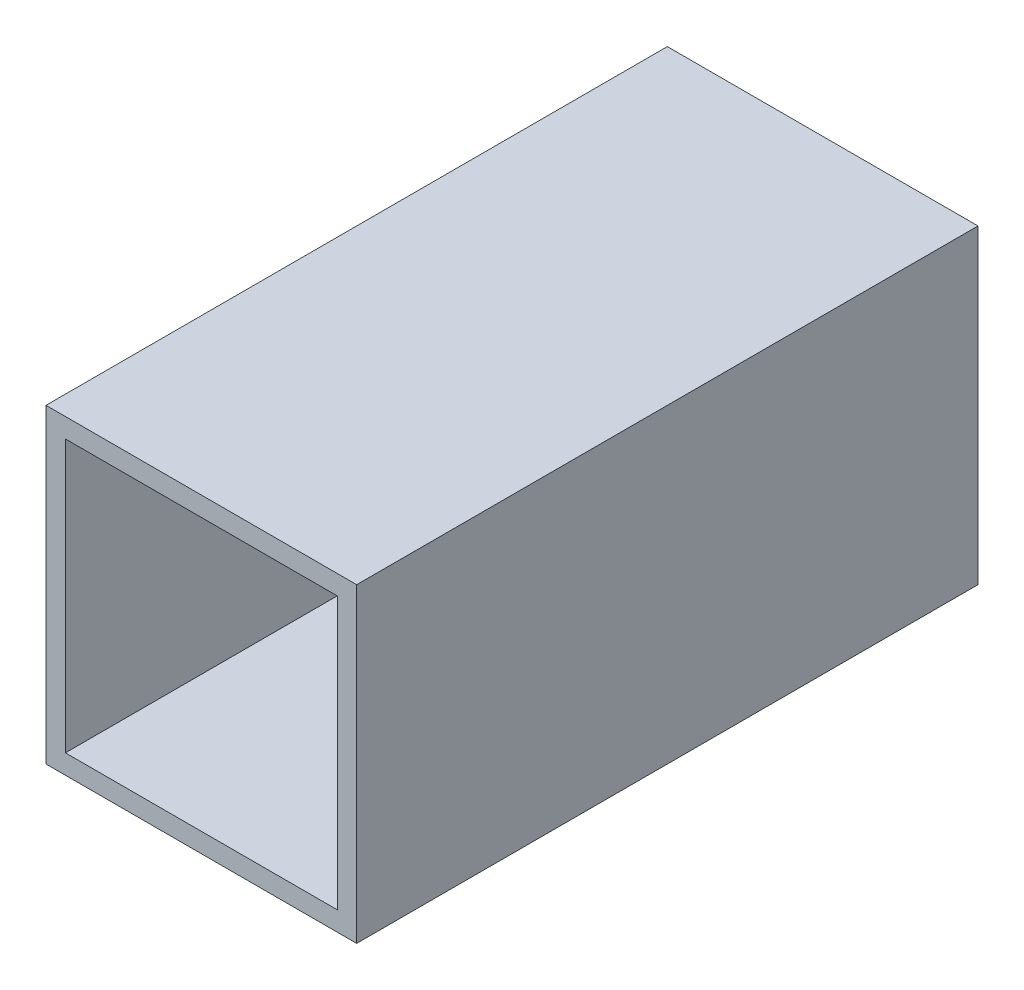
ISO-10303-21;
HEADER;
FILE_DESCRIPTION(('STEP AP214'),'2;1');
FILE_NAME('part.step','',(''),(''),'','','');
FILE_SCHEMA(('AUTOMOTIVE_DESIGN { 1 0 10303 214 1 1 1 1 }'));
ENDSEC;
DATA;
#1=APPLICATION_CONTEXT('core data for automotive mechanical design processes');
#2=APPLICATION_PROTOCOL_DEFINITION('international standard','automotive_design',2000,#1);
#3=PRODUCT_CONTEXT('',#1,'mechanical');
#4=PRODUCT('Part','Part','',(#3));
#5=PRODUCT_RELATED_PRODUCT_CATEGORY('part','',(#4));
#6=PRODUCT_DEFINITION_FORMATION('','',#4);
#7=PRODUCT_DEFINITION_CONTEXT('part definition',#1,'design');
#8=PRODUCT_DEFINITION('design','',#6,#7);
#9=PRODUCT_DEFINITION_SHAPE('','',#8);
#10=(LENGTH_UNIT() NAMED_UNIT(*) SI_UNIT(.MILLI.,.METRE.));
#11=(NAMED_UNIT(*) PLANE_ANGLE_UNIT() SI_UNIT($,.RADIAN.));
#12=(NAMED_UNIT(*) SI_UNIT($,.STERADIAN.) SOLID_ANGLE_UNIT());
#13=UNCERTAINTY_MEASURE_WITH_UNIT(LENGTH_MEASURE(1.E-05),#10,'distance_accuracy_value','');
#14=(GEOMETRIC_REPRESENTATION_CONTEXT(3) GLOBAL_UNCERTAINTY_ASSIGNED_CONTEXT((#13)) GLOBAL_UNIT_ASSIGNED_CONTEXT((#10,
#11,#12)) REPRESENTATION_CONTEXT('',''));
#15=CARTESIAN_POINT('',(0.,0.,0.));
#16=DIRECTION('',(0.,0.,1.));
#17=DIRECTION('',(1.,0.,0.));
#18=AXIS2_PLACEMENT_3D('',#15,#16,#17);
#19=CARTESIAN_POINT('',(0.,0.,50.8));
#20=DIRECTION('',(0.,0.,-1.));
#21=DIRECTION('',(-1.,0.,0.));
#22=AXIS2_PLACEMENT_3D('',#19,#20,#21);
#23=PLANE('',#22);
#24=DIRECTION('',(0.,1.,0.));
#25=VECTOR('',#24,1.);
#26=CARTESIAN_POINT('',(12.7,-12.7,50.8));
#27=LINE('',#26,#25);
#28=CARTESIAN_POINT('',(12.7,-12.7,50.8));
#29=VERTEX_POINT('',#28);
#30=CARTESIAN_POINT('',(12.7,12.7,50.8));
#31=VERTEX_POINT('',#30);
#32=EDGE_CURVE('E133',#29,#31,#27,.T.);
#33=ORIENTED_EDGE('',*,*,#32,.T.);
#34=DIRECTION('',(-1.,0.,0.));
#35=VECTOR('',#34,1.);
#36=CARTESIAN_POINT('',(-12.7,12.7,50.8));
#37=LINE('',#36,#35);
#38=CARTESIAN_POINT('',(-12.7,12.7,50.8));
#39=VERTEX_POINT('',#38);
#40=EDGE_CURVE('E136',#31,#39,#37,.T.);
#41=ORIENTED_EDGE('',*,*,#40,.T.);
#42=DIRECTION('',(0.,-1.,0.));
#43=VECTOR('',#42,1.);
#44=CARTESIAN_POINT('',(-12.7,-12.7,50.8));
#45=LINE('',#44,#43);
#46=CARTESIAN_POINT('',(-12.7,-12.7,50.8));
#47=VERTEX_POINT('',#46);
#48=EDGE_CURVE('E139',#39,#47,#45,.T.);
#49=ORIENTED_EDGE('',*,*,#48,.T.);
#50=DIRECTION('',(1.,0.,0.));
#51=VECTOR('',#50,1.);
#52=CARTESIAN_POINT('',(-12.7,-12.7,50.8));
#53=LINE('',#52,#51);
#54=EDGE_CURVE('E141',#47,#29,#53,.T.);
#55=ORIENTED_EDGE('',*,*,#54,.T.);
#56=EDGE_LOOP('',(#33,#41,#49,#55));
#57=FACE_BOUND('',#56,.T.);
#58=DIRECTION('',(0.,1.,0.));
#59=VECTOR('',#58,1.);
#60=CARTESIAN_POINT('',(11.1125,-11.1125,50.8));
#61=LINE('',#60,#59);
#62=CARTESIAN_POINT('',(11.1125,-11.1125,50.8));
#63=VERTEX_POINT('',#62);
#64=CARTESIAN_POINT('',(11.1125,11.1125,50.8));
#65=VERTEX_POINT('',#64);
#66=EDGE_CURVE('E97',#63,#65,#61,.T.);
#67=ORIENTED_EDGE('',*,*,#66,.F.);
#68=DIRECTION('',(1.,0.,0.));
#69=VECTOR('',#68,1.);
#70=CARTESIAN_POINT('',(-11.1125,-11.1125,50.8));
#71=LINE('',#70,#69);
#72=CARTESIAN_POINT('',(-11.1125,-11.1125,50.8));
#73=VERTEX_POINT('',#72);
#74=EDGE_CURVE('E119',#73,#63,#71,.T.);
#75=ORIENTED_EDGE('',*,*,#74,.F.);
#76=DIRECTION('',(0.,-1.,0.));
#77=VECTOR('',#76,1.);
#78=CARTESIAN_POINT('',(-11.1125,-11.1125,50.8));
#79=LINE('',#78,#77);
#80=CARTESIAN_POINT('',(-11.1125,11.1125,50.8));
#81=VERTEX_POINT('',#80);
#82=EDGE_CURVE('E117',#81,#73,#79,.T.);
#83=ORIENTED_EDGE('',*,*,#82,.F.);
#84=DIRECTION('',(-1.,0.,0.));
#85=VECTOR('',#84,1.);
#86=CARTESIAN_POINT('',(-11.1125,11.1125,50.8));
#87=LINE('',#86,#85);
#88=EDGE_CURVE('E105',#65,#81,#87,.T.);
#89=ORIENTED_EDGE('',*,*,#88,.F.);
#90=EDGE_LOOP('',(#67,#75,#83,#89));
#91=FACE_BOUND('',#90,.T.);
#92=ADVANCED_FACE('F32',(#57,#91),#23,.F.);
#93=CARTESIAN_POINT('',(0.,0.,0.));
#94=DIRECTION('',(0.,0.,-1.));
#95=DIRECTION('',(-1.,0.,0.));
#96=AXIS2_PLACEMENT_3D('',#93,#94,#95);
#97=PLANE('',#96);
#98=DIRECTION('',(0.,1.,0.));
#99=VECTOR('',#98,1.);
#100=CARTESIAN_POINT('',(12.7,-12.7,0.));
#101=LINE('',#100,#99);
#102=CARTESIAN_POINT('',(12.7,-12.7,0.));
#103=VERTEX_POINT('',#102);
#104=CARTESIAN_POINT('',(12.7,12.7,0.));
#105=VERTEX_POINT('',#104);
#106=EDGE_CURVE('E113',#103,#105,#101,.T.);
#107=ORIENTED_EDGE('',*,*,#106,.F.);
#108=DIRECTION('',(1.,0.,0.));
#109=VECTOR('',#108,1.);
#110=CARTESIAN_POINT('',(-12.7,-12.7,0.));
#111=LINE('',#110,#109);
#112=CARTESIAN_POINT('',(-12.7,-12.7,0.));
#113=VERTEX_POINT('',#112);
#114=EDGE_CURVE('E137',#113,#103,#111,.T.);
#115=ORIENTED_EDGE('',*,*,#114,.F.);
#116=DIRECTION('',(0.,-1.,0.));
#117=VECTOR('',#116,1.);
#118=CARTESIAN_POINT('',(-12.7,-12.7,0.));
#119=LINE('',#118,#117);
#120=CARTESIAN_POINT('',(-12.7,12.7,0.));
#121=VERTEX_POINT('',#120);
#122=EDGE_CURVE('E148',#121,#113,#119,.T.);
#123=ORIENTED_EDGE('',*,*,#122,.F.);
#124=DIRECTION('',(-1.,0.,0.));
#125=VECTOR('',#124,1.);
#126=CARTESIAN_POINT('',(-12.7,12.7,0.));
#127=LINE('',#126,#125);
#128=EDGE_CURVE('E146',#105,#121,#127,.T.);
#129=ORIENTED_EDGE('',*,*,#128,.F.);
#130=EDGE_LOOP('',(#107,#115,#123,#129));
#131=FACE_BOUND('',#130,.T.);
#132=DIRECTION('',(1.,0.,0.));
#133=VECTOR('',#132,1.);
#134=CARTESIAN_POINT('',(-11.1125,-11.1125,0.));
#135=LINE('',#134,#133);
#136=CARTESIAN_POINT('',(-11.1125,-11.1125,0.));
#137=VERTEX_POINT('',#136);
#138=CARTESIAN_POINT('',(11.1125,-11.1125,0.));
#139=VERTEX_POINT('',#138);
#140=EDGE_CURVE('E106',#137,#139,#135,.T.);
#141=ORIENTED_EDGE('',*,*,#140,.T.);
#142=DIRECTION('',(0.,1.,0.));
#143=VECTOR('',#142,1.);
#144=CARTESIAN_POINT('',(11.1125,-11.1125,0.));
#145=LINE('',#144,#143);
#146=CARTESIAN_POINT('',(11.1125,11.1125,0.));
#147=VERTEX_POINT('',#146);
#148=EDGE_CURVE('E55',#139,#147,#145,.T.);
#149=ORIENTED_EDGE('',*,*,#148,.T.);
#150=DIRECTION('',(-1.,0.,0.));
#151=VECTOR('',#150,1.);
#152=CARTESIAN_POINT('',(-11.1125,11.1125,0.));
#153=LINE('',#152,#151);
#154=CARTESIAN_POINT('',(-11.1125,11.1125,0.));
#155=VERTEX_POINT('',#154);
#156=EDGE_CURVE('E112',#147,#155,#153,.T.);
#157=ORIENTED_EDGE('',*,*,#156,.T.);
#158=DIRECTION('',(0.,-1.,0.));
#159=VECTOR('',#158,1.);
#160=CARTESIAN_POINT('',(-11.1125,-11.1125,0.));
#161=LINE('',#160,#159);
#162=EDGE_CURVE('E125',#155,#137,#161,.T.);
#163=ORIENTED_EDGE('',*,*,#162,.T.);
#164=EDGE_LOOP('',(#141,#149,#157,#163));
#165=FACE_BOUND('',#164,.T.);
#166=ADVANCED_FACE('F166',(#131,#165),#97,.T.);
#167=CARTESIAN_POINT('',(12.7,-12.7,50.8));
#168=DIRECTION('',(-1.,0.,0.));
#169=DIRECTION('',(0.,0.,1.));
#170=AXIS2_PLACEMENT_3D('',#167,#168,#169);
#171=PLANE('',#170);
#172=ORIENTED_EDGE('',*,*,#106,.T.);
#173=DIRECTION('',(0.,0.,-1.));
#174=VECTOR('',#173,1.);
#175=CARTESIAN_POINT('',(12.7,12.7,50.8));
#176=LINE('',#175,#174);
#177=EDGE_CURVE('E11',#31,#105,#176,.T.);
#178=ORIENTED_EDGE('',*,*,#177,.F.);
#179=ORIENTED_EDGE('',*,*,#32,.F.);
#180=DIRECTION('',(0.,0.,-1.));
#181=VECTOR('',#180,1.);
#182=CARTESIAN_POINT('',(12.7,-12.7,50.8));
#183=LINE('',#182,#181);
#184=EDGE_CURVE('E143',#29,#103,#183,.T.);
#185=ORIENTED_EDGE('',*,*,#184,.T.);
#186=EDGE_LOOP('',(#172,#178,#179,#185));
#187=FACE_BOUND('',#186,.T.);
#188=ADVANCED_FACE('F34',(#187),#171,.F.);
#189=CARTESIAN_POINT('',(-12.7,12.7,50.8));
#190=DIRECTION('',(0.,-1.,0.));
#191=DIRECTION('',(0.,0.,-1.));
#192=AXIS2_PLACEMENT_3D('',#189,#190,#191);
#193=PLANE('',#192);
#194=ORIENTED_EDGE('',*,*,#128,.T.);
#195=DIRECTION('',(0.,0.,-1.));
#196=VECTOR('',#195,1.);
#197=CARTESIAN_POINT('',(-12.7,12.7,50.8));
#198=LINE('',#197,#196);
#199=EDGE_CURVE('E40',#39,#121,#198,.T.);
#200=ORIENTED_EDGE('',*,*,#199,.F.);
#201=ORIENTED_EDGE('',*,*,#40,.F.);
#202=ORIENTED_EDGE('',*,*,#177,.T.);
#203=EDGE_LOOP('',(#194,#200,#201,#202));
#204=FACE_BOUND('',#203,.T.);
#205=ADVANCED_FACE('F176',(#204),#193,.F.);
#206=CARTESIAN_POINT('',(-12.7,-12.7,50.8));
#207=DIRECTION('',(1.,0.,0.));
#208=DIRECTION('',(0.,0.,-1.));
#209=AXIS2_PLACEMENT_3D('',#206,#207,#208);
#210=PLANE('',#209);
#211=ORIENTED_EDGE('',*,*,#122,.T.);
#212=DIRECTION('',(0.,0.,-1.));
#213=VECTOR('',#212,1.);
#214=CARTESIAN_POINT('',(-12.7,-12.7,50.8));
#215=LINE('',#214,#213);
#216=EDGE_CURVE('E153',#47,#113,#215,.T.);
#217=ORIENTED_EDGE('',*,*,#216,.F.);
#218=ORIENTED_EDGE('',*,*,#48,.F.);
#219=ORIENTED_EDGE('',*,*,#199,.T.);
#220=EDGE_LOOP('',(#211,#217,#218,#219));
#221=FACE_BOUND('',#220,.T.);
#222=ADVANCED_FACE('F160',(#221),#210,.F.);
#223=CARTESIAN_POINT('',(-12.7,-12.7,50.8));
#224=DIRECTION('',(0.,1.,0.));
#225=DIRECTION('',(0.,0.,1.));
#226=AXIS2_PLACEMENT_3D('',#223,#224,#225);
#227=PLANE('',#226);
#228=ORIENTED_EDGE('',*,*,#114,.T.);
#229=ORIENTED_EDGE('',*,*,#184,.F.);
#230=ORIENTED_EDGE('',*,*,#54,.F.);
#231=ORIENTED_EDGE('',*,*,#216,.T.);
#232=EDGE_LOOP('',(#228,#229,#230,#231));
#233=FACE_BOUND('',#232,.T.);
#234=ADVANCED_FACE('F170',(#233),#227,.F.);
#235=CARTESIAN_POINT('',(11.1125,-11.1125,50.8));
#236=DIRECTION('',(-1.,0.,0.));
#237=DIRECTION('',(0.,0.,1.));
#238=AXIS2_PLACEMENT_3D('',#235,#236,#237);
#239=PLANE('',#238);
#240=ORIENTED_EDGE('',*,*,#148,.F.);
#241=DIRECTION('',(0.,0.,-1.));
#242=VECTOR('',#241,1.);
#243=CARTESIAN_POINT('',(11.1125,-11.1125,50.8));
#244=LINE('',#243,#242);
#245=EDGE_CURVE('E101',#63,#139,#244,.T.);
#246=ORIENTED_EDGE('',*,*,#245,.F.);
#247=ORIENTED_EDGE('',*,*,#66,.T.);
#248=DIRECTION('',(0.,0.,-1.));
#249=VECTOR('',#248,1.);
#250=CARTESIAN_POINT('',(11.1125,11.1125,50.8));
#251=LINE('',#250,#249);
#252=EDGE_CURVE('E100',#65,#147,#251,.T.);
#253=ORIENTED_EDGE('',*,*,#252,.T.);
#254=EDGE_LOOP('',(#240,#246,#247,#253));
#255=FACE_BOUND('',#254,.T.);
#256=ADVANCED_FACE('F99',(#255),#239,.T.);
#257=CARTESIAN_POINT('',(-11.1125,11.1125,50.8));
#258=DIRECTION('',(0.,-1.,0.));
#259=DIRECTION('',(0.,0.,-1.));
#260=AXIS2_PLACEMENT_3D('',#257,#258,#259);
#261=PLANE('',#260);
#262=ORIENTED_EDGE('',*,*,#156,.F.);
#263=ORIENTED_EDGE('',*,*,#252,.F.);
#264=ORIENTED_EDGE('',*,*,#88,.T.);
#265=DIRECTION('',(0.,0.,-1.));
#266=VECTOR('',#265,1.);
#267=CARTESIAN_POINT('',(-11.1125,11.1125,50.8));
#268=LINE('',#267,#266);
#269=EDGE_CURVE('E114',#81,#155,#268,.T.);
#270=ORIENTED_EDGE('',*,*,#269,.T.);
#271=EDGE_LOOP('',(#262,#263,#264,#270));
#272=FACE_BOUND('',#271,.T.);
#273=ADVANCED_FACE('F109',(#272),#261,.T.);
#274=CARTESIAN_POINT('',(-11.1125,-11.1125,50.8));
#275=DIRECTION('',(1.,0.,0.));
#276=DIRECTION('',(0.,0.,-1.));
#277=AXIS2_PLACEMENT_3D('',#274,#275,#276);
#278=PLANE('',#277);
#279=ORIENTED_EDGE('',*,*,#162,.F.);
#280=ORIENTED_EDGE('',*,*,#269,.F.);
#281=ORIENTED_EDGE('',*,*,#82,.T.);
#282=DIRECTION('',(0.,0.,-1.));
#283=VECTOR('',#282,1.);
#284=CARTESIAN_POINT('',(-11.1125,-11.1125,50.8));
#285=LINE('',#284,#283);
#286=EDGE_CURVE('E47',#73,#137,#285,.T.);
#287=ORIENTED_EDGE('',*,*,#286,.T.);
#288=EDGE_LOOP('',(#279,#280,#281,#287));
#289=FACE_BOUND('',#288,.T.);
#290=ADVANCED_FACE('F199',(#289),#278,.T.);
#291=CARTESIAN_POINT('',(-11.1125,-11.1125,50.8));
#292=DIRECTION('',(0.,1.,0.));
#293=DIRECTION('',(0.,0.,1.));
#294=AXIS2_PLACEMENT_3D('',#291,#292,#293);
#295=PLANE('',#294);
#296=ORIENTED_EDGE('',*,*,#140,.F.);
#297=ORIENTED_EDGE('',*,*,#286,.F.);
#298=ORIENTED_EDGE('',*,*,#74,.T.);
#299=ORIENTED_EDGE('',*,*,#245,.T.);
#300=EDGE_LOOP('',(#296,#297,#298,#299));
#301=FACE_BOUND('',#300,.T.);
#302=ADVANCED_FACE('F203',(#301),#295,.T.);
#303=CLOSED_SHELL('',(#92,#166,#188,#205,#222,#234,#256,#273,#290,#302));
#304=MANIFOLD_SOLID_BREP('B2',#303);
#305=ADVANCED_BREP_SHAPE_REPRESENTATION('',(#18,#304),#14);
#306=SHAPE_DEFINITION_REPRESENTATION(#9,#305);
ENDSEC;
END-ISO-10303-21;
